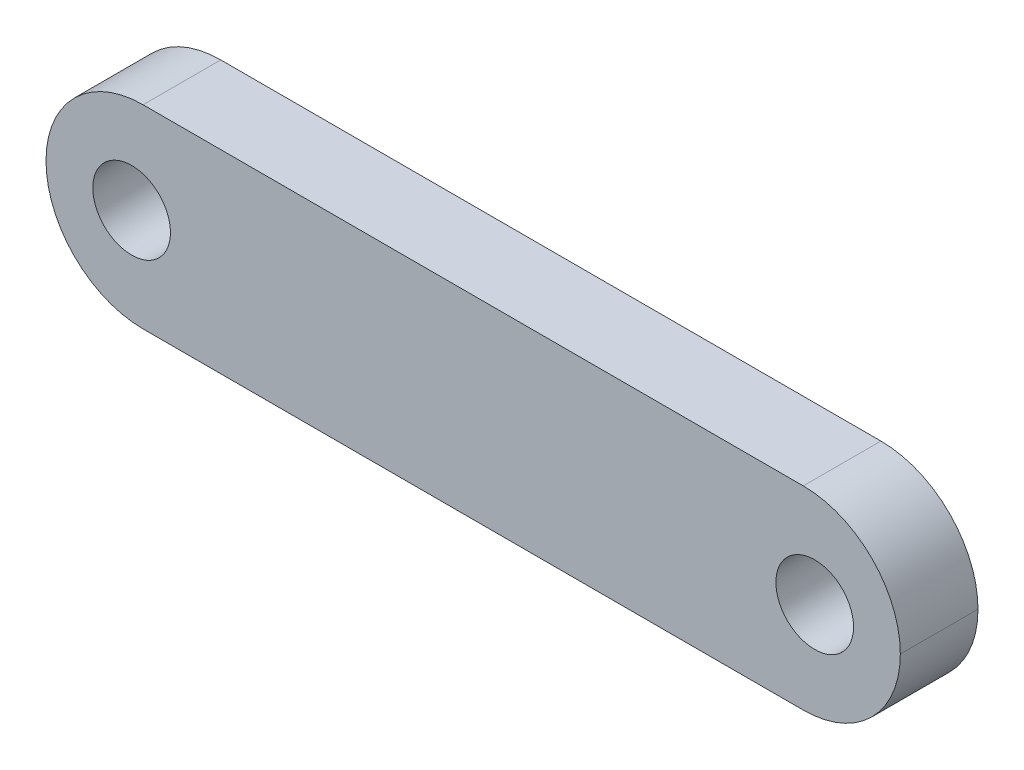
ISO-10303-21;
HEADER;
FILE_DESCRIPTION(('STEP AP214'),'2;1');
FILE_NAME('part.step','',(''),(''),'','','');
FILE_SCHEMA(('AUTOMOTIVE_DESIGN { 1 0 10303 214 1 1 1 1 }'));
ENDSEC;
DATA;
#1=APPLICATION_CONTEXT('core data for automotive mechanical design processes');
#2=APPLICATION_PROTOCOL_DEFINITION('international standard','automotive_design',2000,#1);
#3=PRODUCT_CONTEXT('',#1,'mechanical');
#4=PRODUCT('Part','Part','',(#3));
#5=PRODUCT_RELATED_PRODUCT_CATEGORY('part','',(#4));
#6=PRODUCT_DEFINITION_FORMATION('','',#4);
#7=PRODUCT_DEFINITION_CONTEXT('part definition',#1,'design');
#8=PRODUCT_DEFINITION('design','',#6,#7);
#9=PRODUCT_DEFINITION_SHAPE('','',#8);
#10=(LENGTH_UNIT() NAMED_UNIT(*) SI_UNIT(.MILLI.,.METRE.));
#11=(NAMED_UNIT(*) PLANE_ANGLE_UNIT() SI_UNIT($,.RADIAN.));
#12=(NAMED_UNIT(*) SI_UNIT($,.STERADIAN.) SOLID_ANGLE_UNIT());
#13=UNCERTAINTY_MEASURE_WITH_UNIT(LENGTH_MEASURE(1.E-05),#10,'distance_accuracy_value','');
#14=(GEOMETRIC_REPRESENTATION_CONTEXT(3) GLOBAL_UNCERTAINTY_ASSIGNED_CONTEXT((#13)) GLOBAL_UNIT_ASSIGNED_CONTEXT((#10,
#11,#12)) REPRESENTATION_CONTEXT('',''));
#15=CARTESIAN_POINT('',(0.,0.,0.));
#16=DIRECTION('',(0.,0.,1.));
#17=DIRECTION('',(1.,0.,0.));
#18=AXIS2_PLACEMENT_3D('',#15,#16,#17);
#19=CARTESIAN_POINT('',(0.,0.,2.));
#20=DIRECTION('',(0.,0.,1.));
#21=DIRECTION('',(1.,0.,0.));
#22=AXIS2_PLACEMENT_3D('',#19,#20,#21);
#23=PLANE('',#22);
#24=CARTESIAN_POINT('',(8.79503090527766,0.,2.));
#25=DIRECTION('',(0.,0.,1.));
#26=DIRECTION('',(1.,0.,0.));
#27=AXIS2_PLACEMENT_3D('',#24,#25,#26);
#28=CIRCLE('',#27,1.);
#29=CARTESIAN_POINT('',(9.79503090527766,0.,2.));
#30=VERTEX_POINT('',#29);
#31=EDGE_CURVE('E126',#30,#30,#28,.T.);
#32=ORIENTED_EDGE('',*,*,#31,.F.);
#33=EDGE_LOOP('',(#32));
#34=FACE_BOUND('',#33,.T.);
#35=CARTESIAN_POINT('',(-8.5,0.,2.));
#36=DIRECTION('',(0.,0.,1.));
#37=DIRECTION('',(1.,0.,0.));
#38=AXIS2_PLACEMENT_3D('',#35,#36,#37);
#39=CIRCLE('',#38,2.5);
#40=CARTESIAN_POINT('',(-8.5,2.5,2.));
#41=VERTEX_POINT('',#40);
#42=CARTESIAN_POINT('',(-11.,0.,2.));
#43=VERTEX_POINT('',#42);
#44=EDGE_CURVE('E56',#41,#43,#39,.T.);
#45=ORIENTED_EDGE('',*,*,#44,.T.);
#46=CARTESIAN_POINT('',(-8.5,0.,2.));
#47=DIRECTION('',(0.,0.,1.));
#48=DIRECTION('',(1.,0.,0.));
#49=AXIS2_PLACEMENT_3D('',#46,#47,#48);
#50=CIRCLE('',#49,2.5);
#51=CARTESIAN_POINT('',(-8.5,-2.5,2.));
#52=VERTEX_POINT('',#51);
#53=EDGE_CURVE('E138',#43,#52,#50,.T.);
#54=ORIENTED_EDGE('',*,*,#53,.T.);
#55=DIRECTION('',(1.,0.,0.));
#56=VECTOR('',#55,1.);
#57=CARTESIAN_POINT('',(-11.,-2.5,2.));
#58=LINE('',#57,#56);
#59=CARTESIAN_POINT('',(8.5,-2.5,2.));
#60=VERTEX_POINT('',#59);
#61=EDGE_CURVE('E114',#52,#60,#58,.T.);
#62=ORIENTED_EDGE('',*,*,#61,.T.);
#63=CARTESIAN_POINT('',(8.5,0.,2.));
#64=DIRECTION('',(0.,0.,1.));
#65=DIRECTION('',(1.,0.,0.));
#66=AXIS2_PLACEMENT_3D('',#63,#64,#65);
#67=CIRCLE('',#66,2.5);
#68=CARTESIAN_POINT('',(11.,0.,2.));
#69=VERTEX_POINT('',#68);
#70=EDGE_CURVE('E135',#60,#69,#67,.T.);
#71=ORIENTED_EDGE('',*,*,#70,.T.);
#72=CARTESIAN_POINT('',(8.5,0.,2.));
#73=DIRECTION('',(0.,0.,1.));
#74=DIRECTION('',(1.,0.,0.));
#75=AXIS2_PLACEMENT_3D('',#72,#73,#74);
#76=CIRCLE('',#75,2.5);
#77=CARTESIAN_POINT('',(8.5,2.5,2.));
#78=VERTEX_POINT('',#77);
#79=EDGE_CURVE('E103',#69,#78,#76,.T.);
#80=ORIENTED_EDGE('',*,*,#79,.T.);
#81=DIRECTION('',(-1.,0.,0.));
#82=VECTOR('',#81,1.);
#83=CARTESIAN_POINT('',(-11.,2.5,2.));
#84=LINE('',#83,#82);
#85=EDGE_CURVE('E122',#78,#41,#84,.T.);
#86=ORIENTED_EDGE('',*,*,#85,.T.);
#87=EDGE_LOOP('',(#45,#54,#62,#71,#80,#86));
#88=FACE_BOUND('',#87,.T.);
#89=CARTESIAN_POINT('',(-8.79503090527766,0.,2.));
#90=DIRECTION('',(0.,0.,1.));
#91=DIRECTION('',(-1.,0.,0.));
#92=AXIS2_PLACEMENT_3D('',#89,#90,#91);
#93=CIRCLE('',#92,1.);
#94=CARTESIAN_POINT('',(-9.79503090527766,0.,2.));
#95=VERTEX_POINT('',#94);
#96=EDGE_CURVE('E142',#95,#95,#93,.T.);
#97=ORIENTED_EDGE('',*,*,#96,.F.);
#98=EDGE_LOOP('',(#97));
#99=FACE_BOUND('',#98,.T.);
#100=ADVANCED_FACE('F39',(#34,#88,#99),#23,.T.);
#101=CARTESIAN_POINT('',(0.,0.,0.));
#102=DIRECTION('',(0.,0.,1.));
#103=DIRECTION('',(1.,0.,0.));
#104=AXIS2_PLACEMENT_3D('',#101,#102,#103);
#105=PLANE('',#104);
#106=DIRECTION('',(1.,0.,0.));
#107=VECTOR('',#106,1.);
#108=CARTESIAN_POINT('',(-11.,-2.5,0.));
#109=LINE('',#108,#107);
#110=CARTESIAN_POINT('',(-8.5,-2.5,0.));
#111=VERTEX_POINT('',#110);
#112=CARTESIAN_POINT('',(8.5,-2.5,0.));
#113=VERTEX_POINT('',#112);
#114=EDGE_CURVE('E111',#111,#113,#109,.T.);
#115=ORIENTED_EDGE('',*,*,#114,.F.);
#116=CARTESIAN_POINT('',(-8.5,0.,0.));
#117=DIRECTION('',(0.,0.,1.));
#118=DIRECTION('',(1.,0.,0.));
#119=AXIS2_PLACEMENT_3D('',#116,#117,#118);
#120=CIRCLE('',#119,2.5);
#121=CARTESIAN_POINT('',(-11.,0.,0.));
#122=VERTEX_POINT('',#121);
#123=EDGE_CURVE('E94',#111,#122,#120,.F.);
#124=ORIENTED_EDGE('',*,*,#123,.T.);
#125=CARTESIAN_POINT('',(-8.5,0.,0.));
#126=DIRECTION('',(0.,0.,1.));
#127=DIRECTION('',(1.,0.,0.));
#128=AXIS2_PLACEMENT_3D('',#125,#126,#127);
#129=CIRCLE('',#128,2.5);
#130=CARTESIAN_POINT('',(-8.5,2.5,0.));
#131=VERTEX_POINT('',#130);
#132=EDGE_CURVE('E104',#122,#131,#129,.F.);
#133=ORIENTED_EDGE('',*,*,#132,.T.);
#134=DIRECTION('',(-1.,0.,0.));
#135=VECTOR('',#134,1.);
#136=CARTESIAN_POINT('',(-11.,2.5,0.));
#137=LINE('',#136,#135);
#138=CARTESIAN_POINT('',(8.5,2.5,0.));
#139=VERTEX_POINT('',#138);
#140=EDGE_CURVE('E123',#139,#131,#137,.T.);
#141=ORIENTED_EDGE('',*,*,#140,.F.);
#142=CARTESIAN_POINT('',(8.5,0.,0.));
#143=DIRECTION('',(0.,0.,1.));
#144=DIRECTION('',(1.,0.,0.));
#145=AXIS2_PLACEMENT_3D('',#142,#143,#144);
#146=CIRCLE('',#145,2.5);
#147=CARTESIAN_POINT('',(11.,0.,0.));
#148=VERTEX_POINT('',#147);
#149=EDGE_CURVE('E115',#139,#148,#146,.F.);
#150=ORIENTED_EDGE('',*,*,#149,.T.);
#151=CARTESIAN_POINT('',(8.5,0.,0.));
#152=DIRECTION('',(0.,0.,1.));
#153=DIRECTION('',(1.,0.,0.));
#154=AXIS2_PLACEMENT_3D('',#151,#152,#153);
#155=CIRCLE('',#154,2.5);
#156=EDGE_CURVE('E121',#148,#113,#155,.F.);
#157=ORIENTED_EDGE('',*,*,#156,.T.);
#158=EDGE_LOOP('',(#115,#124,#133,#141,#150,#157));
#159=FACE_BOUND('',#158,.T.);
#160=CARTESIAN_POINT('',(8.79503090527766,0.,0.));
#161=DIRECTION('',(0.,0.,1.));
#162=DIRECTION('',(1.,0.,0.));
#163=AXIS2_PLACEMENT_3D('',#160,#161,#162);
#164=CIRCLE('',#163,1.);
#165=CARTESIAN_POINT('',(9.79503090527766,0.,0.));
#166=VERTEX_POINT('',#165);
#167=EDGE_CURVE('E158',#166,#166,#164,.T.);
#168=ORIENTED_EDGE('',*,*,#167,.T.);
#169=EDGE_LOOP('',(#168));
#170=FACE_BOUND('',#169,.T.);
#171=CARTESIAN_POINT('',(-8.79503090527766,0.,0.));
#172=DIRECTION('',(0.,0.,1.));
#173=DIRECTION('',(-1.,0.,0.));
#174=AXIS2_PLACEMENT_3D('',#171,#172,#173);
#175=CIRCLE('',#174,1.);
#176=CARTESIAN_POINT('',(-9.79503090527766,0.,0.));
#177=VERTEX_POINT('',#176);
#178=EDGE_CURVE('E140',#177,#177,#175,.T.);
#179=ORIENTED_EDGE('',*,*,#178,.T.);
#180=EDGE_LOOP('',(#179));
#181=FACE_BOUND('',#180,.T.);
#182=ADVANCED_FACE('F118',(#159,#170,#181),#105,.F.);
#183=CARTESIAN_POINT('',(-11.,2.5,2.));
#184=DIRECTION('',(0.,-1.,0.));
#185=DIRECTION('',(0.,0.,-1.));
#186=AXIS2_PLACEMENT_3D('',#183,#184,#185);
#187=PLANE('',#186);
#188=ORIENTED_EDGE('',*,*,#140,.T.);
#189=DIRECTION('',(0.,0.,-1.));
#190=VECTOR('',#189,1.);
#191=CARTESIAN_POINT('',(-8.5,2.5,2.));
#192=LINE('',#191,#190);
#193=EDGE_CURVE('E11',#131,#41,#192,.F.);
#194=ORIENTED_EDGE('',*,*,#193,.T.);
#195=ORIENTED_EDGE('',*,*,#85,.F.);
#196=DIRECTION('',(0.,0.,-1.));
#197=VECTOR('',#196,1.);
#198=CARTESIAN_POINT('',(8.5,2.5,2.));
#199=LINE('',#198,#197);
#200=EDGE_CURVE('E48',#78,#139,#199,.T.);
#201=ORIENTED_EDGE('',*,*,#200,.T.);
#202=EDGE_LOOP('',(#188,#194,#195,#201));
#203=FACE_BOUND('',#202,.T.);
#204=ADVANCED_FACE('F153',(#203),#187,.F.);
#205=CARTESIAN_POINT('',(-11.,-2.5,2.));
#206=DIRECTION('',(0.,1.,0.));
#207=DIRECTION('',(0.,0.,1.));
#208=AXIS2_PLACEMENT_3D('',#205,#206,#207);
#209=PLANE('',#208);
#210=ORIENTED_EDGE('',*,*,#61,.F.);
#211=DIRECTION('',(0.,0.,-1.));
#212=VECTOR('',#211,1.);
#213=CARTESIAN_POINT('',(-8.5,-2.5,2.));
#214=LINE('',#213,#212);
#215=EDGE_CURVE('E98',#52,#111,#214,.T.);
#216=ORIENTED_EDGE('',*,*,#215,.T.);
#217=ORIENTED_EDGE('',*,*,#114,.T.);
#218=DIRECTION('',(0.,0.,-1.));
#219=VECTOR('',#218,1.);
#220=CARTESIAN_POINT('',(8.5,-2.5,2.));
#221=LINE('',#220,#219);
#222=EDGE_CURVE('E116',#113,#60,#221,.F.);
#223=ORIENTED_EDGE('',*,*,#222,.T.);
#224=EDGE_LOOP('',(#210,#216,#217,#223));
#225=FACE_BOUND('',#224,.T.);
#226=ADVANCED_FACE('F109',(#225),#209,.F.);
#227=CARTESIAN_POINT('',(8.79503090527766,0.,2.));
#228=DIRECTION('',(0.,0.,-1.));
#229=DIRECTION('',(-1.,0.,0.));
#230=AXIS2_PLACEMENT_3D('',#227,#228,#229);
#231=CYLINDRICAL_SURFACE('',#230,1.);
#232=ORIENTED_EDGE('',*,*,#31,.T.);
#233=EDGE_LOOP('',(#232));
#234=FACE_BOUND('',#233,.T.);
#235=ORIENTED_EDGE('',*,*,#167,.F.);
#236=EDGE_LOOP('',(#235));
#237=FACE_BOUND('',#236,.T.);
#238=ADVANCED_FACE('F178',(#234,#237),#231,.F.);
#239=CARTESIAN_POINT('',(-8.79503090527766,0.,2.));
#240=DIRECTION('',(0.,0.,-1.));
#241=DIRECTION('',(-1.,0.,0.));
#242=AXIS2_PLACEMENT_3D('',#239,#240,#241);
#243=CYLINDRICAL_SURFACE('',#242,1.);
#244=ORIENTED_EDGE('',*,*,#96,.T.);
#245=EDGE_LOOP('',(#244));
#246=FACE_BOUND('',#245,.T.);
#247=ORIENTED_EDGE('',*,*,#178,.F.);
#248=EDGE_LOOP('',(#247));
#249=FACE_BOUND('',#248,.T.);
#250=ADVANCED_FACE('F166',(#246,#249),#243,.F.);
#251=CARTESIAN_POINT('',(-8.5,0.,2.));
#252=DIRECTION('',(0.,0.,-1.));
#253=DIRECTION('',(-1.,0.,0.));
#254=AXIS2_PLACEMENT_3D('',#251,#252,#253);
#255=CYLINDRICAL_SURFACE('',#254,2.5);
#256=DIRECTION('',(0.,0.,-1.));
#257=VECTOR('',#256,1.);
#258=CARTESIAN_POINT('',(-11.,0.,2.));
#259=LINE('',#258,#257);
#260=EDGE_CURVE('E99',#43,#122,#259,.T.);
#261=ORIENTED_EDGE('',*,*,#260,.F.);
#262=ORIENTED_EDGE('',*,*,#44,.F.);
#263=ORIENTED_EDGE('',*,*,#193,.F.);
#264=ORIENTED_EDGE('',*,*,#132,.F.);
#265=EDGE_LOOP('',(#261,#262,#263,#264));
#266=FACE_BOUND('',#265,.T.);
#267=ADVANCED_FACE('F156',(#266),#255,.T.);
#268=CARTESIAN_POINT('',(-8.5,0.,2.));
#269=DIRECTION('',(0.,0.,-1.));
#270=DIRECTION('',(-1.,0.,0.));
#271=AXIS2_PLACEMENT_3D('',#268,#269,#270);
#272=CYLINDRICAL_SURFACE('',#271,2.5);
#273=ORIENTED_EDGE('',*,*,#53,.F.);
#274=ORIENTED_EDGE('',*,*,#260,.T.);
#275=ORIENTED_EDGE('',*,*,#123,.F.);
#276=ORIENTED_EDGE('',*,*,#215,.F.);
#277=EDGE_LOOP('',(#273,#274,#275,#276));
#278=FACE_BOUND('',#277,.T.);
#279=ADVANCED_FACE('F97',(#278),#272,.T.);
#280=CARTESIAN_POINT('',(8.5,0.,2.));
#281=DIRECTION('',(0.,0.,-1.));
#282=DIRECTION('',(-1.,0.,0.));
#283=AXIS2_PLACEMENT_3D('',#280,#281,#282);
#284=CYLINDRICAL_SURFACE('',#283,2.5);
#285=ORIENTED_EDGE('',*,*,#200,.F.);
#286=ORIENTED_EDGE('',*,*,#79,.F.);
#287=DIRECTION('',(0.,0.,-1.));
#288=VECTOR('',#287,1.);
#289=CARTESIAN_POINT('',(11.,0.,2.));
#290=LINE('',#289,#288);
#291=EDGE_CURVE('E43',#148,#69,#290,.F.);
#292=ORIENTED_EDGE('',*,*,#291,.F.);
#293=ORIENTED_EDGE('',*,*,#149,.F.);
#294=EDGE_LOOP('',(#285,#286,#292,#293));
#295=FACE_BOUND('',#294,.T.);
#296=ADVANCED_FACE('F41',(#295),#284,.T.);
#297=CARTESIAN_POINT('',(8.5,0.,2.));
#298=DIRECTION('',(0.,0.,-1.));
#299=DIRECTION('',(-1.,0.,0.));
#300=AXIS2_PLACEMENT_3D('',#297,#298,#299);
#301=CYLINDRICAL_SURFACE('',#300,2.5);
#302=ORIENTED_EDGE('',*,*,#70,.F.);
#303=ORIENTED_EDGE('',*,*,#222,.F.);
#304=ORIENTED_EDGE('',*,*,#156,.F.);
#305=ORIENTED_EDGE('',*,*,#291,.T.);
#306=EDGE_LOOP('',(#302,#303,#304,#305));
#307=FACE_BOUND('',#306,.T.);
#308=ADVANCED_FACE('F147',(#307),#301,.T.);
#309=CLOSED_SHELL('',(#100,#182,#204,#226,#238,#250,#267,#279,#296,#308));
#310=MANIFOLD_SOLID_BREP('B2',#309);
#311=ADVANCED_BREP_SHAPE_REPRESENTATION('',(#18,#310),#14);
#312=SHAPE_DEFINITION_REPRESENTATION(#9,#311);
ENDSEC;
END-ISO-10303-21;
